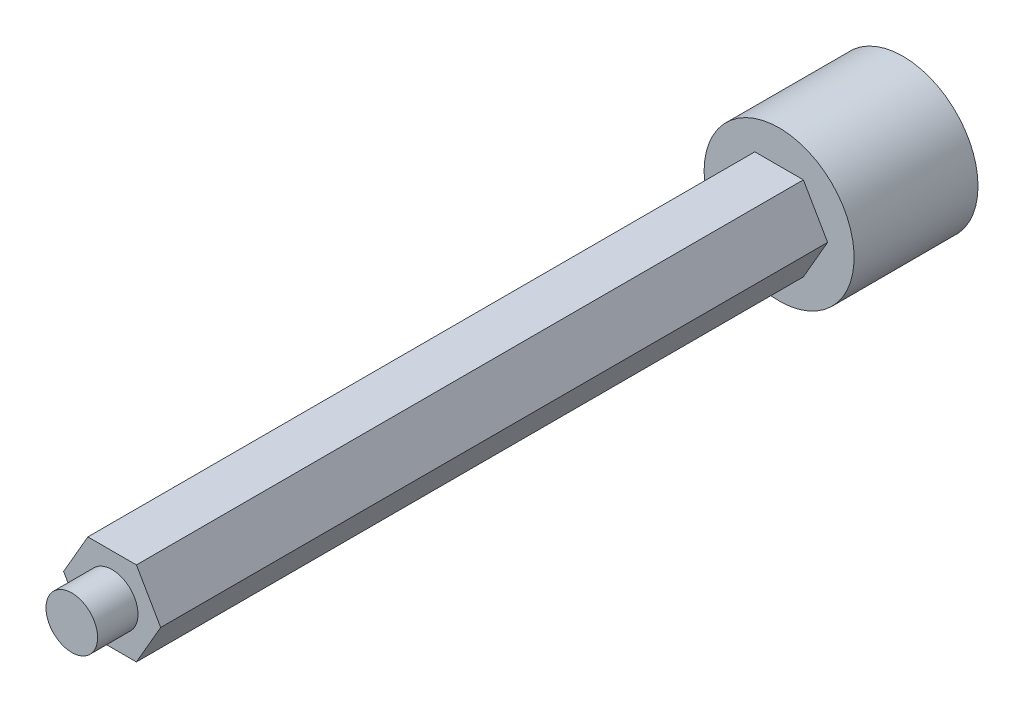
ISO-10303-21;
HEADER;
FILE_DESCRIPTION(('STEP AP214'),'2;1');
FILE_NAME('part.step','',(''),(''),'','','');
FILE_SCHEMA(('AUTOMOTIVE_DESIGN { 1 0 10303 214 1 1 1 1 }'));
ENDSEC;
DATA;
#1=APPLICATION_CONTEXT('core data for automotive mechanical design processes');
#2=APPLICATION_PROTOCOL_DEFINITION('international standard','automotive_design',2000,#1);
#3=PRODUCT_CONTEXT('',#1,'mechanical');
#4=PRODUCT('Part','Part','',(#3));
#5=PRODUCT_RELATED_PRODUCT_CATEGORY('part','',(#4));
#6=PRODUCT_DEFINITION_FORMATION('','',#4);
#7=PRODUCT_DEFINITION_CONTEXT('part definition',#1,'design');
#8=PRODUCT_DEFINITION('design','',#6,#7);
#9=PRODUCT_DEFINITION_SHAPE('','',#8);
#10=(LENGTH_UNIT() NAMED_UNIT(*) SI_UNIT(.MILLI.,.METRE.));
#11=(NAMED_UNIT(*) PLANE_ANGLE_UNIT() SI_UNIT($,.RADIAN.));
#12=(NAMED_UNIT(*) SI_UNIT($,.STERADIAN.) SOLID_ANGLE_UNIT());
#13=UNCERTAINTY_MEASURE_WITH_UNIT(LENGTH_MEASURE(1.E-05),#10,'distance_accuracy_value','');
#14=(GEOMETRIC_REPRESENTATION_CONTEXT(3) GLOBAL_UNCERTAINTY_ASSIGNED_CONTEXT((#13)) GLOBAL_UNIT_ASSIGNED_CONTEXT((#10,
#11,#12)) REPRESENTATION_CONTEXT('',''));
#15=CARTESIAN_POINT('',(0.,0.,0.));
#16=DIRECTION('',(0.,0.,1.));
#17=DIRECTION('',(1.,0.,0.));
#18=AXIS2_PLACEMENT_3D('',#15,#16,#17);
#19=CARTESIAN_POINT('',(0.,0.,1.6));
#20=DIRECTION('',(0.,0.,1.));
#21=DIRECTION('',(1.,0.,0.));
#22=AXIS2_PLACEMENT_3D('',#19,#20,#21);
#23=PLANE('',#22);
#24=CARTESIAN_POINT('',(0.,1.29996290587203E-13,1.6));
#25=DIRECTION('',(0.,0.,1.));
#26=DIRECTION('',(1.,0.,0.));
#27=AXIS2_PLACEMENT_3D('',#24,#25,#26);
#28=CIRCLE('',#27,2.09999999999995);
#29=CARTESIAN_POINT('',(-1.39466841937422,1.57000000000013,1.6));
#30=VERTEX_POINT('',#29);
#31=CARTESIAN_POINT('',(1.39466841937422,1.57000000000013,1.6));
#32=VERTEX_POINT('',#31);
#33=EDGE_CURVE('E145',#30,#32,#28,.T.);
#34=ORIENTED_EDGE('',*,*,#33,.T.);
#35=DIRECTION('',(-1.,0.,0.));
#36=VECTOR('',#35,1.);
#37=CARTESIAN_POINT('',(1.39466841937422,1.57000000000013,1.6));
#38=LINE('',#37,#36);
#39=EDGE_CURVE('E152',#32,#30,#38,.T.);
#40=ORIENTED_EDGE('',*,*,#39,.T.);
#41=EDGE_LOOP('',(#34,#40));
#42=FACE_BOUND('',#41,.T.);
#43=CARTESIAN_POINT('',(0.,0.,1.6));
#44=DIRECTION('',(0.,0.,1.));
#45=DIRECTION('',(1.,0.,0.));
#46=AXIS2_PLACEMENT_3D('',#43,#44,#45);
#47=CIRCLE('',#46,2.20000000000005);
#48=CARTESIAN_POINT('',(2.20000000000005,0.,1.6));
#49=VERTEX_POINT('',#48);
#50=EDGE_CURVE('E44',#49,#49,#47,.T.);
#51=ORIENTED_EDGE('',*,*,#50,.F.);
#52=EDGE_LOOP('',(#51));
#53=FACE_BOUND('',#52,.T.);
#54=ADVANCED_FACE('F35',(#42,#53),#23,.F.);
#55=CARTESIAN_POINT('',(0.,1.29996290587203E-13,10.6));
#56=DIRECTION('',(0.,0.,-1.));
#57=DIRECTION('',(-1.,0.,0.));
#58=AXIS2_PLACEMENT_3D('',#55,#56,#57);
#59=CYLINDRICAL_SURFACE('',#58,2.09999999999995);
#60=ORIENTED_EDGE('',*,*,#33,.F.);
#61=DIRECTION('',(0.,0.,-1.));
#62=VECTOR('',#61,1.);
#63=CARTESIAN_POINT('',(-1.39466841937422,1.57000000000013,10.6));
#64=LINE('',#63,#62);
#65=CARTESIAN_POINT('',(-1.39466841937422,1.57000000000013,10.6));
#66=VERTEX_POINT('',#65);
#67=EDGE_CURVE('E154',#66,#30,#64,.T.);
#68=ORIENTED_EDGE('',*,*,#67,.F.);
#69=CARTESIAN_POINT('',(0.,1.29996290587203E-13,10.6));
#70=DIRECTION('',(0.,0.,1.));
#71=DIRECTION('',(1.,0.,0.));
#72=AXIS2_PLACEMENT_3D('',#69,#70,#71);
#73=CIRCLE('',#72,2.09999999999995);
#74=CARTESIAN_POINT('',(1.39466841937422,1.57000000000013,10.6));
#75=VERTEX_POINT('',#74);
#76=EDGE_CURVE('E148',#66,#75,#73,.T.);
#77=ORIENTED_EDGE('',*,*,#76,.T.);
#78=DIRECTION('',(0.,0.,-1.));
#79=VECTOR('',#78,1.);
#80=CARTESIAN_POINT('',(1.39466841937422,1.57000000000013,10.6));
#81=LINE('',#80,#79);
#82=EDGE_CURVE('E114',#75,#32,#81,.T.);
#83=ORIENTED_EDGE('',*,*,#82,.T.);
#84=EDGE_LOOP('',(#60,#68,#77,#83));
#85=FACE_BOUND('',#84,.T.);
#86=ADVANCED_FACE('F204',(#85),#59,.F.);
#87=CARTESIAN_POINT('',(1.39466841937422,1.57000000000013,10.6));
#88=DIRECTION('',(0.,-1.,0.));
#89=DIRECTION('',(0.,0.,-1.));
#90=AXIS2_PLACEMENT_3D('',#87,#88,#89);
#91=PLANE('',#90);
#92=ORIENTED_EDGE('',*,*,#39,.F.);
#93=ORIENTED_EDGE('',*,*,#82,.F.);
#94=DIRECTION('',(-1.,0.,0.));
#95=VECTOR('',#94,1.);
#96=CARTESIAN_POINT('',(1.39466841937422,1.57000000000013,10.6));
#97=LINE('',#96,#95);
#98=EDGE_CURVE('E151',#75,#66,#97,.T.);
#99=ORIENTED_EDGE('',*,*,#98,.T.);
#100=ORIENTED_EDGE('',*,*,#67,.T.);
#101=EDGE_LOOP('',(#92,#93,#99,#100));
#102=FACE_BOUND('',#101,.T.);
#103=ADVANCED_FACE('F210',(#102),#91,.T.);
#104=CARTESIAN_POINT('',(0.,1.29996290587203E-13,10.6));
#105=DIRECTION('',(0.,0.,1.));
#106=DIRECTION('',(1.,0.,0.));
#107=AXIS2_PLACEMENT_3D('',#104,#105,#106);
#108=PLANE('',#107);
#109=ORIENTED_EDGE('',*,*,#76,.F.);
#110=ORIENTED_EDGE('',*,*,#98,.F.);
#111=EDGE_LOOP('',(#109,#110));
#112=FACE_BOUND('',#111,.T.);
#113=ADVANCED_FACE('F279',(#112),#108,.F.);
#114=CARTESIAN_POINT('',(0.,0.,17.6263608272745));
#115=DIRECTION('',(0.,0.,-1.));
#116=DIRECTION('',(-1.,0.,0.));
#117=AXIS2_PLACEMENT_3D('',#114,#115,#116);
#118=CYLINDRICAL_SURFACE('',#117,5.66617420935412);
#119=CARTESIAN_POINT('',(0.,0.,0.));
#120=DIRECTION('',(0.,0.,1.));
#121=DIRECTION('',(1.,0.,0.));
#122=AXIS2_PLACEMENT_3D('',#119,#120,#121);
#123=CIRCLE('',#122,5.66617420935412);
#124=CARTESIAN_POINT('',(5.66617420935412,0.,0.));
#125=VERTEX_POINT('',#124);
#126=EDGE_CURVE('E142',#125,#125,#123,.T.);
#127=ORIENTED_EDGE('',*,*,#126,.T.);
#128=EDGE_LOOP('',(#127));
#129=FACE_BOUND('',#128,.T.);
#130=CARTESIAN_POINT('',(0.,0.,9.35999999999894));
#131=DIRECTION('',(0.,0.,-1.));
#132=DIRECTION('',(-1.,0.,0.));
#133=AXIS2_PLACEMENT_3D('',#130,#131,#132);
#134=CIRCLE('',#133,5.66617420935412);
#135=CARTESIAN_POINT('',(-5.66617420935412,0.,9.35999999999894));
#136=VERTEX_POINT('',#135);
#137=EDGE_CURVE('E127',#136,#136,#134,.T.);
#138=ORIENTED_EDGE('',*,*,#137,.T.);
#139=EDGE_LOOP('',(#138));
#140=FACE_BOUND('',#139,.T.);
#141=ADVANCED_FACE('F275',(#129,#140),#118,.T.);
#142=CARTESIAN_POINT('',(0.,0.,0.));
#143=DIRECTION('',(0.,0.,1.));
#144=DIRECTION('',(1.,0.,0.));
#145=AXIS2_PLACEMENT_3D('',#142,#143,#144);
#146=PLANE('',#145);
#147=ORIENTED_EDGE('',*,*,#126,.F.);
#148=EDGE_LOOP('',(#147));
#149=FACE_BOUND('',#148,.T.);
#150=CARTESIAN_POINT('',(0.,0.,0.));
#151=DIRECTION('',(0.,0.,1.));
#152=DIRECTION('',(1.,0.,0.));
#153=AXIS2_PLACEMENT_3D('',#150,#151,#152);
#154=CIRCLE('',#153,2.20000000000005);
#155=CARTESIAN_POINT('',(2.20000000000005,0.,0.));
#156=VERTEX_POINT('',#155);
#157=EDGE_CURVE('E134',#156,#156,#154,.T.);
#158=ORIENTED_EDGE('',*,*,#157,.T.);
#159=EDGE_LOOP('',(#158));
#160=FACE_BOUND('',#159,.T.);
#161=ADVANCED_FACE('F271',(#149,#160),#146,.F.);
#162=CARTESIAN_POINT('',(0.,0.,17.6263608272745));
#163=DIRECTION('',(0.,0.,-1.));
#164=DIRECTION('',(-1.,0.,0.));
#165=AXIS2_PLACEMENT_3D('',#162,#163,#164);
#166=CYLINDRICAL_SURFACE('',#165,2.20000000000005);
#167=ORIENTED_EDGE('',*,*,#157,.F.);
#168=EDGE_LOOP('',(#167));
#169=FACE_BOUND('',#168,.T.);
#170=ORIENTED_EDGE('',*,*,#50,.T.);
#171=EDGE_LOOP('',(#170));
#172=FACE_BOUND('',#171,.T.);
#173=ADVANCED_FACE('F268',(#169,#172),#166,.F.);
#174=CARTESIAN_POINT('',(0.,0.,9.35999999999894));
#175=DIRECTION('',(0.,0.,-1.));
#176=DIRECTION('',(-1.,0.,0.));
#177=AXIS2_PLACEMENT_3D('',#174,#175,#176);
#178=PLANE('',#177);
#179=DIRECTION('',(-0.499999999999995,-0.866025403784442,0.));
#180=VECTOR('',#179,1.);
#181=CARTESIAN_POINT('',(1.8330871046771,-3.17499999999998,9.35999999999894));
#182=LINE('',#181,#180);
#183=CARTESIAN_POINT('',(3.66617420935413,0.,9.35999999999894));
#184=VERTEX_POINT('',#183);
#185=CARTESIAN_POINT('',(1.8330871046771,-3.17499999999998,9.35999999999894));
#186=VERTEX_POINT('',#185);
#187=EDGE_CURVE('E109',#184,#186,#182,.T.);
#188=ORIENTED_EDGE('',*,*,#187,.T.);
#189=DIRECTION('',(-1.,0.,0.));
#190=VECTOR('',#189,1.);
#191=CARTESIAN_POINT('',(-1.83308710467704,-3.17500000000002,9.35999999999894));
#192=LINE('',#191,#190);
#193=CARTESIAN_POINT('',(-1.83308710467703,-3.17500000000002,9.35999999999894));
#194=VERTEX_POINT('',#193);
#195=EDGE_CURVE('E118',#186,#194,#192,.T.);
#196=ORIENTED_EDGE('',*,*,#195,.T.);
#197=DIRECTION('',(-0.500000000000007,0.866025403784435,0.));
#198=VECTOR('',#197,1.);
#199=CARTESIAN_POINT('',(-3.66617420935412,0.,9.35999999999894));
#200=LINE('',#199,#198);
#201=CARTESIAN_POINT('',(-3.66617420935412,0.,9.35999999999894));
#202=VERTEX_POINT('',#201);
#203=EDGE_CURVE('E123',#194,#202,#200,.T.);
#204=ORIENTED_EDGE('',*,*,#203,.T.);
#205=DIRECTION('',(0.499999999999995,0.866025403784442,0.));
#206=VECTOR('',#205,1.);
#207=CARTESIAN_POINT('',(-1.83308710467708,3.17499999999999,9.35999999999894));
#208=LINE('',#207,#206);
#209=CARTESIAN_POINT('',(-1.83308710467708,3.17499999999999,9.35999999999894));
#210=VERTEX_POINT('',#209);
#211=EDGE_CURVE('E136',#202,#210,#208,.T.);
#212=ORIENTED_EDGE('',*,*,#211,.T.);
#213=DIRECTION('',(1.,0.,0.));
#214=VECTOR('',#213,1.);
#215=CARTESIAN_POINT('',(1.83308710467705,3.17500000000001,9.35999999999894));
#216=LINE('',#215,#214);
#217=CARTESIAN_POINT('',(1.83308710467706,3.17500000000001,9.35999999999894));
#218=VERTEX_POINT('',#217);
#219=EDGE_CURVE('E59',#210,#218,#216,.T.);
#220=ORIENTED_EDGE('',*,*,#219,.T.);
#221=DIRECTION('',(0.500000000000001,-0.866025403784438,0.));
#222=VECTOR('',#221,1.);
#223=CARTESIAN_POINT('',(3.66617420935412,0.,9.35999999999894));
#224=LINE('',#223,#222);
#225=EDGE_CURVE('E52',#218,#184,#224,.T.);
#226=ORIENTED_EDGE('',*,*,#225,.T.);
#227=EDGE_LOOP('',(#188,#196,#204,#212,#220,#226));
#228=FACE_BOUND('',#227,.T.);
#229=ORIENTED_EDGE('',*,*,#137,.F.);
#230=EDGE_LOOP('',(#229));
#231=FACE_BOUND('',#230,.T.);
#232=ADVANCED_FACE('F125',(#228,#231),#178,.F.);
#233=CARTESIAN_POINT('',(0.,-3.30200000000023,59.744999999999));
#234=DIRECTION('',(0.,0.,-1.));
#235=DIRECTION('',(1.,0.,0.));
#236=AXIS2_PLACEMENT_3D('',#233,#234,#235);
#237=PLANE('',#236);
#238=CARTESIAN_POINT('',(0.,0.,59.7449999999989));
#239=DIRECTION('',(0.,0.,1.));
#240=DIRECTION('',(1.,0.,0.));
#241=AXIS2_PLACEMENT_3D('',#238,#239,#240);
#242=CIRCLE('',#241,1.95);
#243=CARTESIAN_POINT('',(1.95,0.,59.7449999999989));
#244=VERTEX_POINT('',#243);
#245=EDGE_CURVE('E11',#244,#244,#242,.T.);
#246=ORIENTED_EDGE('',*,*,#245,.F.);
#247=EDGE_LOOP('',(#246));
#248=FACE_BOUND('',#247,.T.);
#249=DIRECTION('',(0.500000000000001,-0.866025403784438,0.));
#250=VECTOR('',#249,1.);
#251=CARTESIAN_POINT('',(3.66617420935413,0.,59.7449999999989));
#252=LINE('',#251,#250);
#253=CARTESIAN_POINT('',(1.83308710467706,3.17500000000001,59.7449999999989));
#254=VERTEX_POINT('',#253);
#255=CARTESIAN_POINT('',(3.66617420935413,0.,59.7449999999989));
#256=VERTEX_POINT('',#255);
#257=EDGE_CURVE('E172',#254,#256,#252,.T.);
#258=ORIENTED_EDGE('',*,*,#257,.F.);
#259=DIRECTION('',(1.,0.,0.));
#260=VECTOR('',#259,1.);
#261=CARTESIAN_POINT('',(1.83308710467706,3.17500000000001,59.7449999999989));
#262=LINE('',#261,#260);
#263=CARTESIAN_POINT('',(-1.83308710467708,3.17499999999999,59.7449999999989));
#264=VERTEX_POINT('',#263);
#265=EDGE_CURVE('E169',#264,#254,#262,.T.);
#266=ORIENTED_EDGE('',*,*,#265,.F.);
#267=DIRECTION('',(0.499999999999995,0.866025403784442,0.));
#268=VECTOR('',#267,1.);
#269=CARTESIAN_POINT('',(-1.83308710467708,3.17499999999998,59.7449999999989));
#270=LINE('',#269,#268);
#271=CARTESIAN_POINT('',(-3.66617420935412,0.,59.7449999999989));
#272=VERTEX_POINT('',#271);
#273=EDGE_CURVE('E166',#272,#264,#270,.T.);
#274=ORIENTED_EDGE('',*,*,#273,.F.);
#275=DIRECTION('',(-0.500000000000007,0.866025403784435,0.));
#276=VECTOR('',#275,1.);
#277=CARTESIAN_POINT('',(-3.66617420935412,0.,59.7449999999989));
#278=LINE('',#277,#276);
#279=CARTESIAN_POINT('',(-1.83308710467703,-3.17500000000002,59.744999999999));
#280=VERTEX_POINT('',#279);
#281=EDGE_CURVE('E163',#280,#272,#278,.T.);
#282=ORIENTED_EDGE('',*,*,#281,.F.);
#283=DIRECTION('',(-1.,0.,0.));
#284=VECTOR('',#283,1.);
#285=CARTESIAN_POINT('',(-1.83308710467703,-3.17500000000002,59.744999999999));
#286=LINE('',#285,#284);
#287=CARTESIAN_POINT('',(1.8330871046771,-3.17499999999998,59.744999999999));
#288=VERTEX_POINT('',#287);
#289=EDGE_CURVE('E39',#288,#280,#286,.T.);
#290=ORIENTED_EDGE('',*,*,#289,.F.);
#291=DIRECTION('',(-0.499999999999995,-0.866025403784442,0.));
#292=VECTOR('',#291,1.);
#293=CARTESIAN_POINT('',(1.83308710467709,-3.17499999999999,59.744999999999));
#294=LINE('',#293,#292);
#295=EDGE_CURVE('E110',#256,#288,#294,.T.);
#296=ORIENTED_EDGE('',*,*,#295,.F.);
#297=EDGE_LOOP('',(#258,#266,#274,#282,#290,#296));
#298=FACE_BOUND('',#297,.T.);
#299=ADVANCED_FACE('F185',(#248,#298),#237,.F.);
#300=CARTESIAN_POINT('',(1.8330871046771,-3.17499999999998,69.4447852209888));
#301=DIRECTION('',(-0.866025403784442,0.499999999999995,0.));
#302=DIRECTION('',(-0.499999999999995,-0.866025403784442,0.));
#303=AXIS2_PLACEMENT_3D('',#300,#301,#302);
#304=PLANE('',#303);
#305=ORIENTED_EDGE('',*,*,#187,.F.);
#306=DIRECTION('',(0.,0.,-1.));
#307=VECTOR('',#306,1.);
#308=CARTESIAN_POINT('',(3.66617420935413,0.,69.4447852209888));
#309=LINE('',#308,#307);
#310=EDGE_CURVE('E183',#256,#184,#309,.T.);
#311=ORIENTED_EDGE('',*,*,#310,.F.);
#312=ORIENTED_EDGE('',*,*,#295,.T.);
#313=DIRECTION('',(0.,0.,-1.));
#314=VECTOR('',#313,1.);
#315=CARTESIAN_POINT('',(1.8330871046771,-3.17499999999998,69.4447852209888));
#316=LINE('',#315,#314);
#317=EDGE_CURVE('E105',#288,#186,#316,.T.);
#318=ORIENTED_EDGE('',*,*,#317,.T.);
#319=EDGE_LOOP('',(#305,#311,#312,#318));
#320=FACE_BOUND('',#319,.T.);
#321=ADVANCED_FACE('F37',(#320),#304,.F.);
#322=CARTESIAN_POINT('',(-1.83308710467703,-3.17500000000002,69.4447852209888));
#323=DIRECTION('',(0.,1.,0.));
#324=DIRECTION('',(-1.,0.,0.));
#325=AXIS2_PLACEMENT_3D('',#322,#323,#324);
#326=PLANE('',#325);
#327=ORIENTED_EDGE('',*,*,#195,.F.);
#328=ORIENTED_EDGE('',*,*,#317,.F.);
#329=ORIENTED_EDGE('',*,*,#289,.T.);
#330=DIRECTION('',(0.,0.,-1.));
#331=VECTOR('',#330,1.);
#332=CARTESIAN_POINT('',(-1.83308710467703,-3.17500000000002,69.4447852209888));
#333=LINE('',#332,#331);
#334=EDGE_CURVE('E113',#280,#194,#333,.T.);
#335=ORIENTED_EDGE('',*,*,#334,.T.);
#336=EDGE_LOOP('',(#327,#328,#329,#335));
#337=FACE_BOUND('',#336,.T.);
#338=ADVANCED_FACE('F119',(#337),#326,.F.);
#339=CARTESIAN_POINT('',(-3.66617420935412,0.,69.4447852209888));
#340=DIRECTION('',(0.866025403784435,0.500000000000007,0.));
#341=DIRECTION('',(-0.500000000000007,0.866025403784435,0.));
#342=AXIS2_PLACEMENT_3D('',#339,#340,#341);
#343=PLANE('',#342);
#344=ORIENTED_EDGE('',*,*,#203,.F.);
#345=ORIENTED_EDGE('',*,*,#334,.F.);
#346=ORIENTED_EDGE('',*,*,#281,.T.);
#347=DIRECTION('',(0.,0.,-1.));
#348=VECTOR('',#347,1.);
#349=CARTESIAN_POINT('',(-3.66617420935412,0.,69.4447852209888));
#350=LINE('',#349,#348);
#351=EDGE_CURVE('E177',#272,#202,#350,.T.);
#352=ORIENTED_EDGE('',*,*,#351,.T.);
#353=EDGE_LOOP('',(#344,#345,#346,#352));
#354=FACE_BOUND('',#353,.T.);
#355=ADVANCED_FACE('F188',(#354),#343,.F.);
#356=CARTESIAN_POINT('',(-1.83308710467708,3.17499999999999,69.4447852209888));
#357=DIRECTION('',(0.866025403784442,-0.499999999999995,0.));
#358=DIRECTION('',(0.499999999999995,0.866025403784442,0.));
#359=AXIS2_PLACEMENT_3D('',#356,#357,#358);
#360=PLANE('',#359);
#361=ORIENTED_EDGE('',*,*,#211,.F.);
#362=ORIENTED_EDGE('',*,*,#351,.F.);
#363=ORIENTED_EDGE('',*,*,#273,.T.);
#364=DIRECTION('',(0.,0.,-1.));
#365=VECTOR('',#364,1.);
#366=CARTESIAN_POINT('',(-1.83308710467708,3.17499999999999,69.4447852209888));
#367=LINE('',#366,#365);
#368=EDGE_CURVE('E180',#264,#210,#367,.T.);
#369=ORIENTED_EDGE('',*,*,#368,.T.);
#370=EDGE_LOOP('',(#361,#362,#363,#369));
#371=FACE_BOUND('',#370,.T.);
#372=ADVANCED_FACE('F190',(#371),#360,.F.);
#373=CARTESIAN_POINT('',(1.83308710467706,3.17500000000001,69.4447852209888));
#374=DIRECTION('',(0.,-1.,0.));
#375=DIRECTION('',(1.,0.,0.));
#376=AXIS2_PLACEMENT_3D('',#373,#374,#375);
#377=PLANE('',#376);
#378=ORIENTED_EDGE('',*,*,#219,.F.);
#379=ORIENTED_EDGE('',*,*,#368,.F.);
#380=ORIENTED_EDGE('',*,*,#265,.T.);
#381=DIRECTION('',(0.,0.,-1.));
#382=VECTOR('',#381,1.);
#383=CARTESIAN_POINT('',(1.83308710467706,3.17500000000001,69.4447852209888));
#384=LINE('',#383,#382);
#385=EDGE_CURVE('E182',#254,#218,#384,.T.);
#386=ORIENTED_EDGE('',*,*,#385,.T.);
#387=EDGE_LOOP('',(#378,#379,#380,#386));
#388=FACE_BOUND('',#387,.T.);
#389=ADVANCED_FACE('F191',(#388),#377,.F.);
#390=CARTESIAN_POINT('',(3.66617420935413,0.,69.4447852209888));
#391=DIRECTION('',(-0.866025403784438,-0.500000000000001,0.));
#392=DIRECTION('',(0.500000000000001,-0.866025403784438,0.));
#393=AXIS2_PLACEMENT_3D('',#390,#391,#392);
#394=PLANE('',#393);
#395=ORIENTED_EDGE('',*,*,#225,.F.);
#396=ORIENTED_EDGE('',*,*,#385,.F.);
#397=ORIENTED_EDGE('',*,*,#257,.T.);
#398=ORIENTED_EDGE('',*,*,#310,.T.);
#399=EDGE_LOOP('',(#395,#396,#397,#398));
#400=FACE_BOUND('',#399,.T.);
#401=ADVANCED_FACE('F192',(#400),#394,.F.);
#402=CARTESIAN_POINT('',(0.,0.,68.308432893254));
#403=DIRECTION('',(0.,0.,-1.));
#404=DIRECTION('',(-1.,0.,0.));
#405=AXIS2_PLACEMENT_3D('',#402,#403,#404);
#406=CYLINDRICAL_SURFACE('',#405,1.95);
#407=ORIENTED_EDGE('',*,*,#245,.T.);
#408=EDGE_LOOP('',(#407));
#409=FACE_BOUND('',#408,.T.);
#410=CARTESIAN_POINT('',(0.,0.,62.7929999999989));
#411=DIRECTION('',(0.,0.,1.));
#412=DIRECTION('',(0.,-1.,0.));
#413=AXIS2_PLACEMENT_3D('',#410,#411,#412);
#414=CIRCLE('',#413,1.95);
#415=CARTESIAN_POINT('',(0.,-1.95,62.7929999999989));
#416=VERTEX_POINT('',#415);
#417=EDGE_CURVE('E130',#416,#416,#414,.T.);
#418=ORIENTED_EDGE('',*,*,#417,.F.);
#419=EDGE_LOOP('',(#418));
#420=FACE_BOUND('',#419,.T.);
#421=ADVANCED_FACE('F194',(#409,#420),#406,.T.);
#422=CARTESIAN_POINT('',(0.,0.,62.7929999999989));
#423=DIRECTION('',(0.,0.,1.));
#424=DIRECTION('',(0.,-1.,0.));
#425=AXIS2_PLACEMENT_3D('',#422,#423,#424);
#426=PLANE('',#425);
#427=ORIENTED_EDGE('',*,*,#417,.T.);
#428=EDGE_LOOP('',(#427));
#429=FACE_BOUND('',#428,.T.);
#430=ADVANCED_FACE('F199',(#429),#426,.T.);
#431=CLOSED_SHELL('',(#54,#86,#103,#113,#141,#161,#173,#232,#299,#321,#338,#355,#372,#389,#401,
#421,#430));
#432=MANIFOLD_SOLID_BREP('B2',#431);
#433=ADVANCED_BREP_SHAPE_REPRESENTATION('',(#18,#432),#14);
#434=SHAPE_DEFINITION_REPRESENTATION(#9,#433);
ENDSEC;
END-ISO-10303-21;
